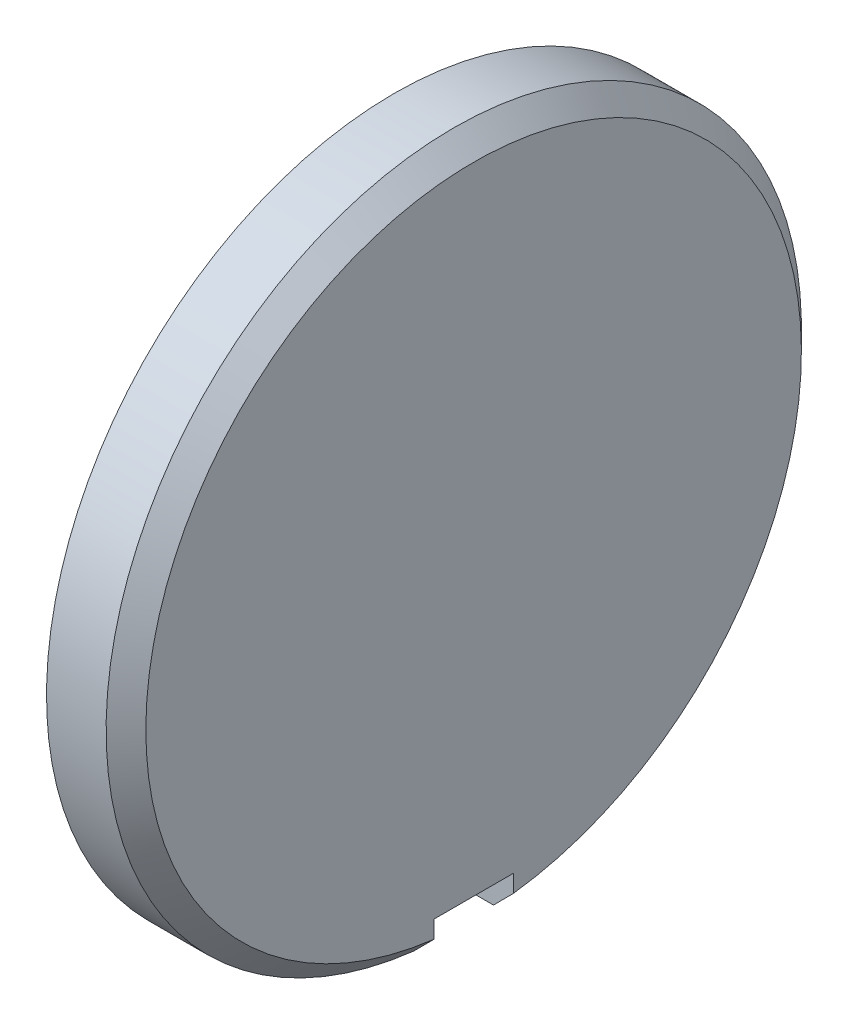
ISO-10303-21;
HEADER;
FILE_DESCRIPTION(('STEP AP214'),'2;1');
FILE_NAME('part.step','',(''),(''),'','','');
FILE_SCHEMA(('AUTOMOTIVE_DESIGN { 1 0 10303 214 1 1 1 1 }'));
ENDSEC;
DATA;
#1=APPLICATION_CONTEXT('core data for automotive mechanical design processes');
#2=APPLICATION_PROTOCOL_DEFINITION('international standard','automotive_design',2000,#1);
#3=PRODUCT_CONTEXT('',#1,'mechanical');
#4=PRODUCT('Part','Part','',(#3));
#5=PRODUCT_RELATED_PRODUCT_CATEGORY('part','',(#4));
#6=PRODUCT_DEFINITION_FORMATION('','',#4);
#7=PRODUCT_DEFINITION_CONTEXT('part definition',#1,'design');
#8=PRODUCT_DEFINITION('design','',#6,#7);
#9=PRODUCT_DEFINITION_SHAPE('','',#8);
#10=(LENGTH_UNIT() NAMED_UNIT(*) SI_UNIT(.MILLI.,.METRE.));
#11=(NAMED_UNIT(*) PLANE_ANGLE_UNIT() SI_UNIT($,.RADIAN.));
#12=(NAMED_UNIT(*) SI_UNIT($,.STERADIAN.) SOLID_ANGLE_UNIT());
#13=UNCERTAINTY_MEASURE_WITH_UNIT(LENGTH_MEASURE(1.E-05),#10,'distance_accuracy_value','');
#14=(GEOMETRIC_REPRESENTATION_CONTEXT(3) GLOBAL_UNCERTAINTY_ASSIGNED_CONTEXT((#13)) GLOBAL_UNIT_ASSIGNED_CONTEXT((#10,
#11,#12)) REPRESENTATION_CONTEXT('',''));
#15=CARTESIAN_POINT('',(0.,0.,0.));
#16=DIRECTION('',(0.,0.,1.));
#17=DIRECTION('',(1.,0.,0.));
#18=AXIS2_PLACEMENT_3D('',#15,#16,#17);
#19=CARTESIAN_POINT('',(85.6,-65.,-52.));
#20=DIRECTION('',(-1.,0.,0.));
#21=DIRECTION('',(0.,0.,1.));
#22=AXIS2_PLACEMENT_3D('',#19,#20,#21);
#23=PLANE('',#22);
#24=DIRECTION('',(0.,-1.,0.));
#25=VECTOR('',#24,1.);
#26=CARTESIAN_POINT('',(85.6,-65.,-51.2));
#27=LINE('',#26,#25);
#28=CARTESIAN_POINT('',(85.6,-71.2,-51.2));
#29=VERTEX_POINT('',#28);
#30=CARTESIAN_POINT('',(85.6,-71.5513357416637,-51.2));
#31=VERTEX_POINT('',#30);
#32=EDGE_CURVE('E210',#29,#31,#27,.T.);
#33=ORIENTED_EDGE('',*,*,#32,.F.);
#34=DIRECTION('',(0.,0.,1.));
#35=VECTOR('',#34,1.);
#36=CARTESIAN_POINT('',(85.6,-71.2,-52.));
#37=LINE('',#36,#35);
#38=CARTESIAN_POINT('',(85.6,-71.2,-52.8));
#39=VERTEX_POINT('',#38);
#40=EDGE_CURVE('E202',#39,#29,#37,.T.);
#41=ORIENTED_EDGE('',*,*,#40,.F.);
#42=DIRECTION('',(0.,-1.,0.));
#43=VECTOR('',#42,1.);
#44=CARTESIAN_POINT('',(85.6,-65.,-52.8));
#45=LINE('',#44,#43);
#46=CARTESIAN_POINT('',(85.6,-71.5513357416637,-52.8));
#47=VERTEX_POINT('',#46);
#48=EDGE_CURVE('E188',#39,#47,#45,.T.);
#49=ORIENTED_EDGE('',*,*,#48,.T.);
#50=CARTESIAN_POINT('',(85.6,-65.,-52.));
#51=DIRECTION('',(-1.,0.,0.));
#52=DIRECTION('',(0.,0.,1.));
#53=AXIS2_PLACEMENT_3D('',#50,#51,#52);
#54=CIRCLE('',#53,6.6);
#55=EDGE_CURVE('E315',#31,#47,#54,.T.);
#56=ORIENTED_EDGE('',*,*,#55,.F.);
#57=EDGE_LOOP('',(#33,#41,#49,#56));
#58=FACE_BOUND('',#57,.T.);
#59=ADVANCED_FACE('F47',(#58),#23,.F.);
#60=CARTESIAN_POINT('',(85.6,-65.,-52.));
#61=DIRECTION('',(-1.,0.,0.));
#62=DIRECTION('',(0.,0.,1.));
#63=AXIS2_PLACEMENT_3D('',#60,#61,#62);
#64=CONICAL_SURFACE('',#63,6.6,0.785398163397466);
#65=CARTESIAN_POINT('',(86.4946271909999,-70.6490068941078,-51.2));
#66=CARTESIAN_POINT('',(86.3124416781385,-70.8330057927748,-51.2));
#67=CARTESIAN_POINT('',(86.1301724326838,-71.0169217300399,-51.2));
#68=CARTESIAN_POINT('',(85.7654990840124,-71.3846197394094,-51.2));
#69=CARTESIAN_POINT('',(85.5830949808418,-71.5684018115597,-51.2));
#70=CARTESIAN_POINT('',(85.2181844268204,-71.9358642466467,-51.2));
#71=CARTESIAN_POINT('',(85.0356779759848,-72.1195446095986,-51.2));
#72=CARTESIAN_POINT('',(84.6705824210977,-72.4868233002689,-51.2));
#73=CARTESIAN_POINT('',(84.4879933170182,-72.6704216279594,-51.2));
#74=CARTESIAN_POINT('',(84.3053728090001,-72.8539886990545,-51.2));
#75=B_SPLINE_CURVE_WITH_KNOTS('',3,(#65,#66,#67,#68,#69,#70,#71,#72,#73,#74),.UNSPECIFIED.,.F.,
.F.,(4,2,2,2,4),(0.,0.776803884748463,1.55360750407648,2.33041100759796,3.10721477439803),.UNSPECIFIED.);
#76=CARTESIAN_POINT('',(85.2,-71.9541354602855,-51.2));
#77=VERTEX_POINT('',#76);
#78=EDGE_CURVE('E217',#31,#77,#75,.T.);
#79=ORIENTED_EDGE('',*,*,#78,.F.);
#80=ORIENTED_EDGE('',*,*,#55,.T.);
#81=CARTESIAN_POINT('',(86.4946271909999,-70.6490068941078,-52.8));
#82=CARTESIAN_POINT('',(86.3124416781385,-70.8330057927748,-52.8));
#83=CARTESIAN_POINT('',(86.1301724326838,-71.0169217300399,-52.8));
#84=CARTESIAN_POINT('',(85.7654990840124,-71.3846197394094,-52.8));
#85=CARTESIAN_POINT('',(85.5830949808418,-71.5684018115597,-52.8));
#86=CARTESIAN_POINT('',(85.2181844268204,-71.9358642466467,-52.8));
#87=CARTESIAN_POINT('',(85.0356779759848,-72.1195446095986,-52.8));
#88=CARTESIAN_POINT('',(84.6705824210977,-72.4868233002689,-52.8));
#89=CARTESIAN_POINT('',(84.4879933170182,-72.6704216279594,-52.8));
#90=CARTESIAN_POINT('',(84.3053728090001,-72.8539886990545,-52.8));
#91=B_SPLINE_CURVE_WITH_KNOTS('',3,(#81,#82,#83,#84,#85,#86,#87,#88,#89,#90),.UNSPECIFIED.,.F.,
.F.,(4,2,2,2,4),(0.,0.776803884748463,1.55360750407648,2.33041100759796,3.10721477439803),.UNSPECIFIED.);
#92=CARTESIAN_POINT('',(85.2,-71.9541354602855,-52.8));
#93=VERTEX_POINT('',#92);
#94=EDGE_CURVE('E191',#47,#93,#91,.T.);
#95=ORIENTED_EDGE('',*,*,#94,.T.);
#96=CARTESIAN_POINT('',(85.2,-65.,-52.));
#97=DIRECTION('',(-1.,0.,0.));
#98=DIRECTION('',(0.,0.,1.));
#99=AXIS2_PLACEMENT_3D('',#96,#97,#98);
#100=CIRCLE('',#99,7.);
#101=EDGE_CURVE('E311',#77,#93,#100,.T.);
#102=ORIENTED_EDGE('',*,*,#101,.F.);
#103=EDGE_LOOP('',(#79,#80,#95,#102));
#104=FACE_BOUND('',#103,.T.);
#105=ADVANCED_FACE('F470',(#104),#64,.T.);
#106=CARTESIAN_POINT('',(77.8,-65.,-52.));
#107=DIRECTION('',(-1.,0.,0.));
#108=DIRECTION('',(0.,0.,1.));
#109=AXIS2_PLACEMENT_3D('',#106,#107,#108);
#110=CYLINDRICAL_SURFACE('',#109,7.);
#111=DIRECTION('',(-1.,0.,0.));
#112=VECTOR('',#111,1.);
#113=CARTESIAN_POINT('',(77.8,-71.9541354602855,-51.2));
#114=LINE('',#113,#112);
#115=CARTESIAN_POINT('',(84.,-71.9541354602855,-51.2));
#116=VERTEX_POINT('',#115);
#117=EDGE_CURVE('E197',#77,#116,#114,.T.);
#118=ORIENTED_EDGE('',*,*,#117,.F.);
#119=ORIENTED_EDGE('',*,*,#101,.T.);
#120=DIRECTION('',(-1.,0.,0.));
#121=VECTOR('',#120,1.);
#122=CARTESIAN_POINT('',(77.8,-71.9541354602855,-52.8));
#123=LINE('',#122,#121);
#124=CARTESIAN_POINT('',(84.,-71.9541354602855,-52.8));
#125=VERTEX_POINT('',#124);
#126=EDGE_CURVE('E679',#93,#125,#123,.T.);
#127=ORIENTED_EDGE('',*,*,#126,.T.);
#128=CARTESIAN_POINT('',(84.,-65.,-52.));
#129=DIRECTION('',(-1.,0.,0.));
#130=DIRECTION('',(0.,0.,1.));
#131=AXIS2_PLACEMENT_3D('',#128,#129,#130);
#132=CIRCLE('',#131,7.);
#133=EDGE_CURVE('E307',#116,#125,#132,.T.);
#134=ORIENTED_EDGE('',*,*,#133,.F.);
#135=EDGE_LOOP('',(#118,#119,#127,#134));
#136=FACE_BOUND('',#135,.T.);
#137=ADVANCED_FACE('F475',(#136),#110,.T.);
#138=CARTESIAN_POINT('',(84.,-58.,-52.));
#139=DIRECTION('',(1.,0.,0.));
#140=DIRECTION('',(0.,0.,-1.));
#141=AXIS2_PLACEMENT_3D('',#138,#139,#140);
#142=PLANE('',#141);
#143=CARTESIAN_POINT('',(84.,-65.,-52.));
#144=DIRECTION('',(-1.,0.,0.));
#145=DIRECTION('',(0.,0.,1.));
#146=AXIS2_PLACEMENT_3D('',#143,#144,#145);
#147=CIRCLE('',#146,3.);
#148=CARTESIAN_POINT('',(84.,-65.,-49.));
#149=VERTEX_POINT('',#148);
#150=EDGE_CURVE('E301',#149,#149,#147,.T.);
#151=ORIENTED_EDGE('',*,*,#150,.F.);
#152=EDGE_LOOP('',(#151));
#153=FACE_BOUND('',#152,.T.);
#154=DIRECTION('',(0.,1.,0.));
#155=VECTOR('',#154,1.);
#156=CARTESIAN_POINT('',(84.,-58.,-51.2));
#157=LINE('',#156,#155);
#158=CARTESIAN_POINT('',(84.,-71.2,-51.2));
#159=VERTEX_POINT('',#158);
#160=EDGE_CURVE('E11',#116,#159,#157,.T.);
#161=ORIENTED_EDGE('',*,*,#160,.F.);
#162=ORIENTED_EDGE('',*,*,#133,.T.);
#163=DIRECTION('',(0.,1.,0.));
#164=VECTOR('',#163,1.);
#165=CARTESIAN_POINT('',(84.,-58.,-52.8));
#166=LINE('',#165,#164);
#167=CARTESIAN_POINT('',(84.,-71.2,-52.8));
#168=VERTEX_POINT('',#167);
#169=EDGE_CURVE('E363',#125,#168,#166,.T.);
#170=ORIENTED_EDGE('',*,*,#169,.T.);
#171=DIRECTION('',(0.,0.,-1.));
#172=VECTOR('',#171,1.);
#173=CARTESIAN_POINT('',(84.,-71.2,-52.));
#174=LINE('',#173,#172);
#175=EDGE_CURVE('E56',#159,#168,#174,.T.);
#176=ORIENTED_EDGE('',*,*,#175,.F.);
#177=EDGE_LOOP('',(#161,#162,#170,#176));
#178=FACE_BOUND('',#177,.T.);
#179=ADVANCED_FACE('F498',(#153,#178),#142,.F.);
#180=CARTESIAN_POINT('',(82.8,-62.,-52.));
#181=DIRECTION('',(1.,0.,0.));
#182=DIRECTION('',(0.,0.,-1.));
#183=AXIS2_PLACEMENT_3D('',#180,#181,#182);
#184=PLANE('',#183);
#185=DIRECTION('',(0.,1.,0.));
#186=VECTOR('',#185,1.);
#187=CARTESIAN_POINT('',(82.8,-62.,-51.6));
#188=LINE('',#187,#186);
#189=CARTESIAN_POINT('',(82.8,-67.9732137494637,-51.6));
#190=VERTEX_POINT('',#189);
#191=CARTESIAN_POINT('',(82.8,-67.2649503305812,-51.6));
#192=VERTEX_POINT('',#191);
#193=EDGE_CURVE('E248',#190,#192,#188,.T.);
#194=ORIENTED_EDGE('',*,*,#193,.F.);
#195=CARTESIAN_POINT('',(82.8,-65.,-52.));
#196=DIRECTION('',(-1.,0.,0.));
#197=DIRECTION('',(0.,0.,1.));
#198=AXIS2_PLACEMENT_3D('',#195,#196,#197);
#199=CIRCLE('',#198,3.);
#200=CARTESIAN_POINT('',(82.8,-65.4,-49.0267862505363));
#201=VERTEX_POINT('',#200);
#202=EDGE_CURVE('E296',#190,#201,#199,.T.);
#203=ORIENTED_EDGE('',*,*,#202,.T.);
#204=DIRECTION('',(0.,0.,1.));
#205=VECTOR('',#204,1.);
#206=CARTESIAN_POINT('',(82.8,-65.4,-52.));
#207=LINE('',#206,#205);
#208=CARTESIAN_POINT('',(82.8,-65.4,-49.7350496694188));
#209=VERTEX_POINT('',#208);
#210=EDGE_CURVE('E284',#209,#201,#207,.T.);
#211=ORIENTED_EDGE('',*,*,#210,.F.);
#212=CARTESIAN_POINT('',(82.8,-65.,-52.));
#213=DIRECTION('',(-1.,0.,0.));
#214=DIRECTION('',(0.,0.,1.));
#215=AXIS2_PLACEMENT_3D('',#212,#213,#214);
#216=CIRCLE('',#215,2.3);
#217=EDGE_CURVE('E322',#192,#209,#216,.T.);
#218=ORIENTED_EDGE('',*,*,#217,.F.);
#219=EDGE_LOOP('',(#194,#203,#211,#218));
#220=FACE_BOUND('',#219,.T.);
#221=ADVANCED_FACE('F418',(#220),#184,.F.);
#222=DIRECTION('',(0.,1.,0.));
#223=VECTOR('',#222,1.);
#224=CARTESIAN_POINT('',(82.8,-62.,-51.6));
#225=LINE('',#224,#223);
#226=CARTESIAN_POINT('',(82.8,-62.7350496694188,-51.6));
#227=VERTEX_POINT('',#226);
#228=CARTESIAN_POINT('',(82.8,-62.0267862505363,-51.6));
#229=VERTEX_POINT('',#228);
#230=EDGE_CURVE('E242',#227,#229,#225,.T.);
#231=ORIENTED_EDGE('',*,*,#230,.F.);
#232=CARTESIAN_POINT('',(82.8,-64.6,-49.7350496694188));
#233=VERTEX_POINT('',#232);
#234=EDGE_CURVE('E323',#233,#227,#216,.T.);
#235=ORIENTED_EDGE('',*,*,#234,.F.);
#236=DIRECTION('',(0.,0.,-1.));
#237=VECTOR('',#236,1.);
#238=CARTESIAN_POINT('',(82.8,-64.6,-52.));
#239=LINE('',#238,#237);
#240=CARTESIAN_POINT('',(82.8,-64.6,-49.0267862505363));
#241=VERTEX_POINT('',#240);
#242=EDGE_CURVE('E273',#241,#233,#239,.T.);
#243=ORIENTED_EDGE('',*,*,#242,.F.);
#244=EDGE_CURVE('E297',#241,#229,#199,.T.);
#245=ORIENTED_EDGE('',*,*,#244,.T.);
#246=EDGE_LOOP('',(#231,#235,#243,#245));
#247=FACE_BOUND('',#246,.T.);
#248=ADVANCED_FACE('F436',(#247),#184,.F.);
#249=CARTESIAN_POINT('',(77.8,-65.,-52.));
#250=DIRECTION('',(-1.,0.,0.));
#251=DIRECTION('',(0.,0.,1.));
#252=AXIS2_PLACEMENT_3D('',#249,#250,#251);
#253=CYLINDRICAL_SURFACE('',#252,2.3);
#254=CARTESIAN_POINT('',(84.,-65.,-52.));
#255=DIRECTION('',(-1.,0.,0.));
#256=DIRECTION('',(0.,0.,1.));
#257=AXIS2_PLACEMENT_3D('',#254,#255,#256);
#258=CIRCLE('',#257,2.3);
#259=CARTESIAN_POINT('',(84.,-65.,-49.7));
#260=VERTEX_POINT('',#259);
#261=EDGE_CURVE('E318',#260,#260,#258,.T.);
#262=ORIENTED_EDGE('',*,*,#261,.F.);
#263=EDGE_LOOP('',(#262));
#264=FACE_BOUND('',#263,.T.);
#265=DIRECTION('',(-1.,0.,0.));
#266=VECTOR('',#265,1.);
#267=CARTESIAN_POINT('',(77.8,-67.2649503305812,-51.6));
#268=LINE('',#267,#266);
#269=CARTESIAN_POINT('',(83.98,-67.2649503305812,-51.6));
#270=VERTEX_POINT('',#269);
#271=EDGE_CURVE('E251',#192,#270,#268,.F.);
#272=ORIENTED_EDGE('',*,*,#271,.F.);
#273=ORIENTED_EDGE('',*,*,#217,.T.);
#274=DIRECTION('',(-1.,0.,0.));
#275=VECTOR('',#274,1.);
#276=CARTESIAN_POINT('',(77.8,-65.4,-49.7350496694188));
#277=LINE('',#276,#275);
#278=CARTESIAN_POINT('',(83.98,-65.4,-49.7350496694188));
#279=VERTEX_POINT('',#278);
#280=EDGE_CURVE('E288',#279,#209,#277,.T.);
#281=ORIENTED_EDGE('',*,*,#280,.F.);
#282=CARTESIAN_POINT('',(83.98,-65.,-52.));
#283=DIRECTION('',(-1.,0.,0.));
#284=DIRECTION('',(0.,0.,1.));
#285=AXIS2_PLACEMENT_3D('',#282,#283,#284);
#286=CIRCLE('',#285,2.3);
#287=CARTESIAN_POINT('',(83.98,-64.6,-49.7350496694188));
#288=VERTEX_POINT('',#287);
#289=EDGE_CURVE('E280',#288,#279,#286,.F.);
#290=ORIENTED_EDGE('',*,*,#289,.F.);
#291=DIRECTION('',(-1.,0.,0.));
#292=VECTOR('',#291,1.);
#293=CARTESIAN_POINT('',(77.8,-64.6,-49.7350496694188));
#294=LINE('',#293,#292);
#295=EDGE_CURVE('E277',#233,#288,#294,.F.);
#296=ORIENTED_EDGE('',*,*,#295,.F.);
#297=ORIENTED_EDGE('',*,*,#234,.T.);
#298=DIRECTION('',(-1.,0.,0.));
#299=VECTOR('',#298,1.);
#300=CARTESIAN_POINT('',(77.8,-62.7350496694188,-51.6));
#301=LINE('',#300,#299);
#302=CARTESIAN_POINT('',(83.98,-62.7350496694188,-51.6));
#303=VERTEX_POINT('',#302);
#304=EDGE_CURVE('E245',#303,#227,#301,.T.);
#305=ORIENTED_EDGE('',*,*,#304,.F.);
#306=CARTESIAN_POINT('',(83.98,-65.,-52.));
#307=DIRECTION('',(-1.,0.,0.));
#308=DIRECTION('',(0.,0.,1.));
#309=AXIS2_PLACEMENT_3D('',#306,#307,#308);
#310=CIRCLE('',#309,2.3);
#311=CARTESIAN_POINT('',(83.98,-62.7350496694188,-52.4));
#312=VERTEX_POINT('',#311);
#313=EDGE_CURVE('E254',#312,#303,#310,.F.);
#314=ORIENTED_EDGE('',*,*,#313,.F.);
#315=DIRECTION('',(-1.,0.,0.));
#316=VECTOR('',#315,1.);
#317=CARTESIAN_POINT('',(77.8,-62.7350496694188,-52.4));
#318=LINE('',#317,#316);
#319=CARTESIAN_POINT('',(82.8,-62.7350496694188,-52.4));
#320=VERTEX_POINT('',#319);
#321=EDGE_CURVE('E230',#312,#320,#318,.T.);
#322=ORIENTED_EDGE('',*,*,#321,.T.);
#323=CARTESIAN_POINT('',(82.8,-64.6,-54.2649503305812));
#324=VERTEX_POINT('',#323);
#325=EDGE_CURVE('E328',#320,#324,#216,.T.);
#326=ORIENTED_EDGE('',*,*,#325,.T.);
#327=DIRECTION('',(-1.,0.,0.));
#328=VECTOR('',#327,1.);
#329=CARTESIAN_POINT('',(77.8,-64.6,-54.2649503305812));
#330=LINE('',#329,#328);
#331=CARTESIAN_POINT('',(83.98,-64.6,-54.2649503305812));
#332=VERTEX_POINT('',#331);
#333=EDGE_CURVE('E272',#332,#324,#330,.T.);
#334=ORIENTED_EDGE('',*,*,#333,.F.);
#335=CARTESIAN_POINT('',(83.98,-65.4,-54.2649503305812));
#336=VERTEX_POINT('',#335);
#337=EDGE_CURVE('E283',#336,#332,#286,.F.);
#338=ORIENTED_EDGE('',*,*,#337,.F.);
#339=DIRECTION('',(-1.,0.,0.));
#340=VECTOR('',#339,1.);
#341=CARTESIAN_POINT('',(77.8,-65.4,-54.2649503305812));
#342=LINE('',#341,#340);
#343=CARTESIAN_POINT('',(82.8,-65.4,-54.2649503305812));
#344=VERTEX_POINT('',#343);
#345=EDGE_CURVE('E293',#344,#336,#342,.F.);
#346=ORIENTED_EDGE('',*,*,#345,.F.);
#347=CARTESIAN_POINT('',(82.8,-67.2649503305812,-52.4));
#348=VERTEX_POINT('',#347);
#349=EDGE_CURVE('E329',#344,#348,#216,.T.);
#350=ORIENTED_EDGE('',*,*,#349,.T.);
#351=DIRECTION('',(-1.,0.,0.));
#352=VECTOR('',#351,1.);
#353=CARTESIAN_POINT('',(77.8,-67.2649503305812,-52.4));
#354=LINE('',#353,#352);
#355=CARTESIAN_POINT('',(83.98,-67.2649503305812,-52.4));
#356=VERTEX_POINT('',#355);
#357=EDGE_CURVE('E238',#348,#356,#354,.F.);
#358=ORIENTED_EDGE('',*,*,#357,.T.);
#359=EDGE_CURVE('E257',#270,#356,#310,.F.);
#360=ORIENTED_EDGE('',*,*,#359,.F.);
#361=EDGE_LOOP('',(#272,#273,#281,#290,#296,#297,#305,#314,#322,#326,#334,#338,#346,#350,#358,#360));
#362=FACE_BOUND('',#361,.T.);
#363=ADVANCED_FACE('F397',(#264,#362),#253,.F.);
#364=CARTESIAN_POINT('',(77.8,-65.,-52.));
#365=DIRECTION('',(-1.,0.,0.));
#366=DIRECTION('',(0.,0.,1.));
#367=AXIS2_PLACEMENT_3D('',#364,#365,#366);
#368=CYLINDRICAL_SURFACE('',#367,3.);
#369=ORIENTED_EDGE('',*,*,#150,.T.);
#370=EDGE_LOOP('',(#369));
#371=FACE_BOUND('',#370,.T.);
#372=DIRECTION('',(-1.,0.,0.));
#373=VECTOR('',#372,1.);
#374=CARTESIAN_POINT('',(77.8,-67.9732137494637,-51.6));
#375=LINE('',#374,#373);
#376=CARTESIAN_POINT('',(83.98,-67.9732137494637,-51.6));
#377=VERTEX_POINT('',#376);
#378=EDGE_CURVE('E360',#377,#190,#375,.T.);
#379=ORIENTED_EDGE('',*,*,#378,.F.);
#380=CARTESIAN_POINT('',(83.98,-65.,-52.));
#381=DIRECTION('',(-1.,0.,0.));
#382=DIRECTION('',(0.,0.,1.));
#383=AXIS2_PLACEMENT_3D('',#380,#381,#382);
#384=CIRCLE('',#383,3.);
#385=CARTESIAN_POINT('',(83.98,-67.9732137494637,-52.4));
#386=VERTEX_POINT('',#385);
#387=EDGE_CURVE('E353',#386,#377,#384,.T.);
#388=ORIENTED_EDGE('',*,*,#387,.F.);
#389=DIRECTION('',(-1.,0.,0.));
#390=VECTOR('',#389,1.);
#391=CARTESIAN_POINT('',(77.8,-67.9732137494637,-52.4));
#392=LINE('',#391,#390);
#393=CARTESIAN_POINT('',(82.8,-67.9732137494637,-52.4));
#394=VERTEX_POINT('',#393);
#395=EDGE_CURVE('E356',#386,#394,#392,.T.);
#396=ORIENTED_EDGE('',*,*,#395,.T.);
#397=CARTESIAN_POINT('',(82.8,-65.4,-54.9732137494637));
#398=VERTEX_POINT('',#397);
#399=EDGE_CURVE('E303',#398,#394,#199,.T.);
#400=ORIENTED_EDGE('',*,*,#399,.F.);
#401=DIRECTION('',(-1.,0.,0.));
#402=VECTOR('',#401,1.);
#403=CARTESIAN_POINT('',(77.8,-65.4,-54.9732137494637));
#404=LINE('',#403,#402);
#405=CARTESIAN_POINT('',(83.98,-65.4,-54.9732137494637));
#406=VERTEX_POINT('',#405);
#407=EDGE_CURVE('E335',#406,#398,#404,.T.);
#408=ORIENTED_EDGE('',*,*,#407,.F.);
#409=CARTESIAN_POINT('',(83.98,-65.,-52.));
#410=DIRECTION('',(-1.,0.,0.));
#411=DIRECTION('',(0.,0.,1.));
#412=AXIS2_PLACEMENT_3D('',#409,#410,#411);
#413=CIRCLE('',#412,3.);
#414=CARTESIAN_POINT('',(83.98,-64.6,-54.9732137494637));
#415=VERTEX_POINT('',#414);
#416=EDGE_CURVE('E332',#415,#406,#413,.T.);
#417=ORIENTED_EDGE('',*,*,#416,.F.);
#418=DIRECTION('',(-1.,0.,0.));
#419=VECTOR('',#418,1.);
#420=CARTESIAN_POINT('',(77.8,-64.6,-54.9732137494637));
#421=LINE('',#420,#419);
#422=CARTESIAN_POINT('',(82.8,-64.6,-54.9732137494637));
#423=VERTEX_POINT('',#422);
#424=EDGE_CURVE('E327',#423,#415,#421,.F.);
#425=ORIENTED_EDGE('',*,*,#424,.F.);
#426=CARTESIAN_POINT('',(82.8,-62.0267862505363,-52.4));
#427=VERTEX_POINT('',#426);
#428=EDGE_CURVE('E302',#427,#423,#199,.T.);
#429=ORIENTED_EDGE('',*,*,#428,.F.);
#430=DIRECTION('',(-1.,0.,0.));
#431=VECTOR('',#430,1.);
#432=CARTESIAN_POINT('',(77.8,-62.0267862505363,-52.4));
#433=LINE('',#432,#431);
#434=CARTESIAN_POINT('',(83.98,-62.0267862505363,-52.4));
#435=VERTEX_POINT('',#434);
#436=EDGE_CURVE('E345',#427,#435,#433,.F.);
#437=ORIENTED_EDGE('',*,*,#436,.T.);
#438=CARTESIAN_POINT('',(83.98,-62.0267862505363,-51.6));
#439=VERTEX_POINT('',#438);
#440=EDGE_CURVE('E349',#439,#435,#384,.T.);
#441=ORIENTED_EDGE('',*,*,#440,.F.);
#442=DIRECTION('',(-1.,0.,0.));
#443=VECTOR('',#442,1.);
#444=CARTESIAN_POINT('',(77.8,-62.0267862505363,-51.6));
#445=LINE('',#444,#443);
#446=EDGE_CURVE('E352',#229,#439,#445,.F.);
#447=ORIENTED_EDGE('',*,*,#446,.F.);
#448=ORIENTED_EDGE('',*,*,#244,.F.);
#449=DIRECTION('',(-1.,0.,0.));
#450=VECTOR('',#449,1.);
#451=CARTESIAN_POINT('',(77.8,-64.6,-49.0267862505363));
#452=LINE('',#451,#450);
#453=CARTESIAN_POINT('',(83.98,-64.6,-49.0267862505363));
#454=VERTEX_POINT('',#453);
#455=EDGE_CURVE('E339',#454,#241,#452,.T.);
#456=ORIENTED_EDGE('',*,*,#455,.F.);
#457=CARTESIAN_POINT('',(83.98,-65.4,-49.0267862505363));
#458=VERTEX_POINT('',#457);
#459=EDGE_CURVE('E336',#458,#454,#413,.T.);
#460=ORIENTED_EDGE('',*,*,#459,.F.);
#461=DIRECTION('',(-1.,0.,0.));
#462=VECTOR('',#461,1.);
#463=CARTESIAN_POINT('',(77.8,-65.4,-49.0267862505363));
#464=LINE('',#463,#462);
#465=EDGE_CURVE('E342',#201,#458,#464,.F.);
#466=ORIENTED_EDGE('',*,*,#465,.F.);
#467=ORIENTED_EDGE('',*,*,#202,.F.);
#468=EDGE_LOOP('',(#379,#388,#396,#400,#408,#417,#425,#429,#437,#441,#447,#448,#456,#460,#466,#467));
#469=FACE_BOUND('',#468,.T.);
#470=ADVANCED_FACE('F406',(#371,#469),#368,.T.);
#471=ORIENTED_EDGE('',*,*,#399,.T.);
#472=DIRECTION('',(0.,1.,0.));
#473=VECTOR('',#472,1.);
#474=CARTESIAN_POINT('',(82.8,-62.,-52.4));
#475=LINE('',#474,#473);
#476=EDGE_CURVE('E234',#394,#348,#475,.T.);
#477=ORIENTED_EDGE('',*,*,#476,.T.);
#478=ORIENTED_EDGE('',*,*,#349,.F.);
#479=EDGE_CURVE('E289',#398,#344,#207,.T.);
#480=ORIENTED_EDGE('',*,*,#479,.F.);
#481=EDGE_LOOP('',(#471,#477,#478,#480));
#482=FACE_BOUND('',#481,.T.);
#483=ADVANCED_FACE('F49',(#482),#184,.F.);
#484=ORIENTED_EDGE('',*,*,#325,.F.);
#485=DIRECTION('',(0.,1.,0.));
#486=VECTOR('',#485,1.);
#487=CARTESIAN_POINT('',(82.8,-62.,-52.4));
#488=LINE('',#487,#486);
#489=EDGE_CURVE('E226',#320,#427,#488,.T.);
#490=ORIENTED_EDGE('',*,*,#489,.T.);
#491=ORIENTED_EDGE('',*,*,#428,.T.);
#492=EDGE_CURVE('E268',#324,#423,#239,.T.);
#493=ORIENTED_EDGE('',*,*,#492,.F.);
#494=EDGE_LOOP('',(#484,#490,#491,#493));
#495=FACE_BOUND('',#494,.T.);
#496=ADVANCED_FACE('F450',(#495),#184,.F.);
#497=CARTESIAN_POINT('',(84.,-62.7,-52.));
#498=DIRECTION('',(1.,0.,0.));
#499=DIRECTION('',(0.,0.,-1.));
#500=AXIS2_PLACEMENT_3D('',#497,#498,#499);
#501=PLANE('',#500);
#502=ORIENTED_EDGE('',*,*,#261,.T.);
#503=EDGE_LOOP('',(#502));
#504=FACE_BOUND('',#503,.T.);
#505=ADVANCED_FACE('F481',(#504),#501,.F.);
#506=CARTESIAN_POINT('',(82.7,-64.6,-48.8));
#507=DIRECTION('',(0.,-1.,0.));
#508=DIRECTION('',(0.,0.,-1.));
#509=AXIS2_PLACEMENT_3D('',#506,#507,#508);
#510=PLANE('',#509);
#511=ORIENTED_EDGE('',*,*,#333,.T.);
#512=ORIENTED_EDGE('',*,*,#492,.T.);
#513=ORIENTED_EDGE('',*,*,#424,.T.);
#514=DIRECTION('',(0.,0.,-1.));
#515=VECTOR('',#514,1.);
#516=CARTESIAN_POINT('',(83.98,-64.6,-48.8));
#517=LINE('',#516,#515);
#518=EDGE_CURVE('E258',#332,#415,#517,.T.);
#519=ORIENTED_EDGE('',*,*,#518,.F.);
#520=EDGE_LOOP('',(#511,#512,#513,#519));
#521=FACE_BOUND('',#520,.T.);
#522=ADVANCED_FACE('F453',(#521),#510,.T.);
#523=CARTESIAN_POINT('',(83.98,-65.4,-48.8));
#524=DIRECTION('',(-1.,0.,0.));
#525=DIRECTION('',(0.,0.,1.));
#526=AXIS2_PLACEMENT_3D('',#523,#524,#525);
#527=PLANE('',#526);
#528=ORIENTED_EDGE('',*,*,#337,.T.);
#529=ORIENTED_EDGE('',*,*,#518,.T.);
#530=ORIENTED_EDGE('',*,*,#416,.T.);
#531=DIRECTION('',(0.,0.,-1.));
#532=VECTOR('',#531,1.);
#533=CARTESIAN_POINT('',(83.98,-65.4,-48.8));
#534=LINE('',#533,#532);
#535=EDGE_CURVE('E263',#336,#406,#534,.T.);
#536=ORIENTED_EDGE('',*,*,#535,.F.);
#537=EDGE_LOOP('',(#528,#529,#530,#536));
#538=FACE_BOUND('',#537,.T.);
#539=ADVANCED_FACE('F458',(#538),#527,.T.);
#540=CARTESIAN_POINT('',(82.7,-65.4,-48.8));
#541=DIRECTION('',(0.,1.,0.));
#542=DIRECTION('',(0.,0.,1.));
#543=AXIS2_PLACEMENT_3D('',#540,#541,#542);
#544=PLANE('',#543);
#545=ORIENTED_EDGE('',*,*,#345,.T.);
#546=ORIENTED_EDGE('',*,*,#535,.T.);
#547=ORIENTED_EDGE('',*,*,#407,.T.);
#548=ORIENTED_EDGE('',*,*,#479,.T.);
#549=EDGE_LOOP('',(#545,#546,#547,#548));
#550=FACE_BOUND('',#549,.T.);
#551=ADVANCED_FACE('F460',(#550),#544,.T.);
#552=ORIENTED_EDGE('',*,*,#280,.T.);
#553=ORIENTED_EDGE('',*,*,#210,.T.);
#554=ORIENTED_EDGE('',*,*,#465,.T.);
#555=EDGE_CURVE('E267',#458,#279,#534,.T.);
#556=ORIENTED_EDGE('',*,*,#555,.T.);
#557=EDGE_LOOP('',(#552,#553,#554,#556));
#558=FACE_BOUND('',#557,.T.);
#559=ADVANCED_FACE('F421',(#558),#544,.T.);
#560=ORIENTED_EDGE('',*,*,#289,.T.);
#561=ORIENTED_EDGE('',*,*,#555,.F.);
#562=ORIENTED_EDGE('',*,*,#459,.T.);
#563=EDGE_CURVE('E262',#454,#288,#517,.T.);
#564=ORIENTED_EDGE('',*,*,#563,.T.);
#565=EDGE_LOOP('',(#560,#561,#562,#564));
#566=FACE_BOUND('',#565,.T.);
#567=ADVANCED_FACE('F427',(#566),#527,.T.);
#568=ORIENTED_EDGE('',*,*,#295,.T.);
#569=ORIENTED_EDGE('',*,*,#563,.F.);
#570=ORIENTED_EDGE('',*,*,#455,.T.);
#571=ORIENTED_EDGE('',*,*,#242,.T.);
#572=EDGE_LOOP('',(#568,#569,#570,#571));
#573=FACE_BOUND('',#572,.T.);
#574=ADVANCED_FACE('F539',(#573),#510,.T.);
#575=CARTESIAN_POINT('',(0.,0.,-51.6));
#576=DIRECTION('',(0.,0.,-1.));
#577=DIRECTION('',(-1.,0.,0.));
#578=AXIS2_PLACEMENT_3D('',#575,#576,#577);
#579=PLANE('',#578);
#580=ORIENTED_EDGE('',*,*,#304,.T.);
#581=ORIENTED_EDGE('',*,*,#230,.T.);
#582=ORIENTED_EDGE('',*,*,#446,.T.);
#583=DIRECTION('',(0.,1.,0.));
#584=VECTOR('',#583,1.);
#585=CARTESIAN_POINT('',(83.98,-68.2,-51.6));
#586=LINE('',#585,#584);
#587=EDGE_CURVE('E221',#303,#439,#586,.T.);
#588=ORIENTED_EDGE('',*,*,#587,.F.);
#589=EDGE_LOOP('',(#580,#581,#582,#588));
#590=FACE_BOUND('',#589,.T.);
#591=ADVANCED_FACE('F439',(#590),#579,.T.);
#592=CARTESIAN_POINT('',(0.,0.,-52.4));
#593=DIRECTION('',(0.,0.,-1.));
#594=DIRECTION('',(-1.,0.,0.));
#595=AXIS2_PLACEMENT_3D('',#592,#593,#594);
#596=PLANE('',#595);
#597=DIRECTION('',(0.,1.,0.));
#598=VECTOR('',#597,1.);
#599=CARTESIAN_POINT('',(83.98,-68.2,-52.4));
#600=LINE('',#599,#598);
#601=EDGE_CURVE('E71',#312,#435,#600,.T.);
#602=ORIENTED_EDGE('',*,*,#601,.T.);
#603=ORIENTED_EDGE('',*,*,#436,.F.);
#604=ORIENTED_EDGE('',*,*,#489,.F.);
#605=ORIENTED_EDGE('',*,*,#321,.F.);
#606=EDGE_LOOP('',(#602,#603,#604,#605));
#607=FACE_BOUND('',#606,.T.);
#608=ADVANCED_FACE('F564',(#607),#596,.F.);
#609=CARTESIAN_POINT('',(83.98,-68.2,-51.6));
#610=DIRECTION('',(-1.,0.,0.));
#611=DIRECTION('',(0.,0.,1.));
#612=AXIS2_PLACEMENT_3D('',#609,#610,#611);
#613=PLANE('',#612);
#614=ORIENTED_EDGE('',*,*,#313,.T.);
#615=ORIENTED_EDGE('',*,*,#587,.T.);
#616=ORIENTED_EDGE('',*,*,#440,.T.);
#617=ORIENTED_EDGE('',*,*,#601,.F.);
#618=EDGE_LOOP('',(#614,#615,#616,#617));
#619=FACE_BOUND('',#618,.T.);
#620=ADVANCED_FACE('F444',(#619),#613,.T.);
#621=ORIENTED_EDGE('',*,*,#359,.T.);
#622=EDGE_CURVE('E215',#386,#356,#600,.T.);
#623=ORIENTED_EDGE('',*,*,#622,.F.);
#624=ORIENTED_EDGE('',*,*,#387,.T.);
#625=EDGE_CURVE('E224',#377,#270,#586,.T.);
#626=ORIENTED_EDGE('',*,*,#625,.T.);
#627=EDGE_LOOP('',(#621,#623,#624,#626));
#628=FACE_BOUND('',#627,.T.);
#629=ADVANCED_FACE('F410',(#628),#613,.T.);
#630=ORIENTED_EDGE('',*,*,#271,.T.);
#631=ORIENTED_EDGE('',*,*,#625,.F.);
#632=ORIENTED_EDGE('',*,*,#378,.T.);
#633=ORIENTED_EDGE('',*,*,#193,.T.);
#634=EDGE_LOOP('',(#630,#631,#632,#633));
#635=FACE_BOUND('',#634,.T.);
#636=ADVANCED_FACE('F412',(#635),#579,.T.);
#637=ORIENTED_EDGE('',*,*,#476,.F.);
#638=ORIENTED_EDGE('',*,*,#395,.F.);
#639=ORIENTED_EDGE('',*,*,#622,.T.);
#640=ORIENTED_EDGE('',*,*,#357,.F.);
#641=EDGE_LOOP('',(#637,#638,#639,#640));
#642=FACE_BOUND('',#641,.T.);
#643=ADVANCED_FACE('F391',(#642),#596,.F.);
#644=CARTESIAN_POINT('',(83.9,-71.2,-51.2));
#645=DIRECTION('',(0.,-1.,0.));
#646=DIRECTION('',(0.,0.,-1.));
#647=AXIS2_PLACEMENT_3D('',#644,#645,#646);
#648=PLANE('',#647);
#649=ORIENTED_EDGE('',*,*,#40,.T.);
#650=DIRECTION('',(-1.,0.,0.));
#651=VECTOR('',#650,1.);
#652=CARTESIAN_POINT('',(83.9,-71.2,-51.2));
#653=LINE('',#652,#651);
#654=EDGE_CURVE('E207',#29,#159,#653,.T.);
#655=ORIENTED_EDGE('',*,*,#654,.T.);
#656=ORIENTED_EDGE('',*,*,#175,.T.);
#657=DIRECTION('',(-1.,0.,0.));
#658=VECTOR('',#657,1.);
#659=CARTESIAN_POINT('',(83.9,-71.2,-52.8));
#660=LINE('',#659,#658);
#661=EDGE_CURVE('E63',#39,#168,#660,.T.);
#662=ORIENTED_EDGE('',*,*,#661,.F.);
#663=EDGE_LOOP('',(#649,#655,#656,#662));
#664=FACE_BOUND('',#663,.T.);
#665=ADVANCED_FACE('F200',(#664),#648,.T.);
#666=CARTESIAN_POINT('',(0.,0.,-51.2));
#667=DIRECTION('',(0.,0.,-1.));
#668=DIRECTION('',(-1.,0.,0.));
#669=AXIS2_PLACEMENT_3D('',#666,#667,#668);
#670=PLANE('',#669);
#671=ORIENTED_EDGE('',*,*,#32,.T.);
#672=ORIENTED_EDGE('',*,*,#78,.T.);
#673=ORIENTED_EDGE('',*,*,#117,.T.);
#674=ORIENTED_EDGE('',*,*,#160,.T.);
#675=ORIENTED_EDGE('',*,*,#654,.F.);
#676=EDGE_LOOP('',(#671,#672,#673,#674,#675));
#677=FACE_BOUND('',#676,.T.);
#678=ADVANCED_FACE('F648',(#677),#670,.T.);
#679=CARTESIAN_POINT('',(0.,0.,-52.8));
#680=DIRECTION('',(0.,0.,-1.));
#681=DIRECTION('',(-1.,0.,0.));
#682=AXIS2_PLACEMENT_3D('',#679,#680,#681);
#683=PLANE('',#682);
#684=ORIENTED_EDGE('',*,*,#661,.T.);
#685=ORIENTED_EDGE('',*,*,#169,.F.);
#686=ORIENTED_EDGE('',*,*,#126,.F.);
#687=ORIENTED_EDGE('',*,*,#94,.F.);
#688=ORIENTED_EDGE('',*,*,#48,.F.);
#689=EDGE_LOOP('',(#684,#685,#686,#687,#688));
#690=FACE_BOUND('',#689,.T.);
#691=ADVANCED_FACE('F189',(#690),#683,.F.);
#692=CLOSED_SHELL('',(#59,#105,#137,#179,#221,#248,#363,#470,#483,#496,#505,#522,#539,#551,#559,
#567,#574,#591,#608,#620,#629,#636,#643,#665,#678,#691));
#693=MANIFOLD_SOLID_BREP('B2',#692);
#694=ADVANCED_BREP_SHAPE_REPRESENTATION('',(#18,#693),#14);
#695=SHAPE_DEFINITION_REPRESENTATION(#9,#694);
ENDSEC;
END-ISO-10303-21;
